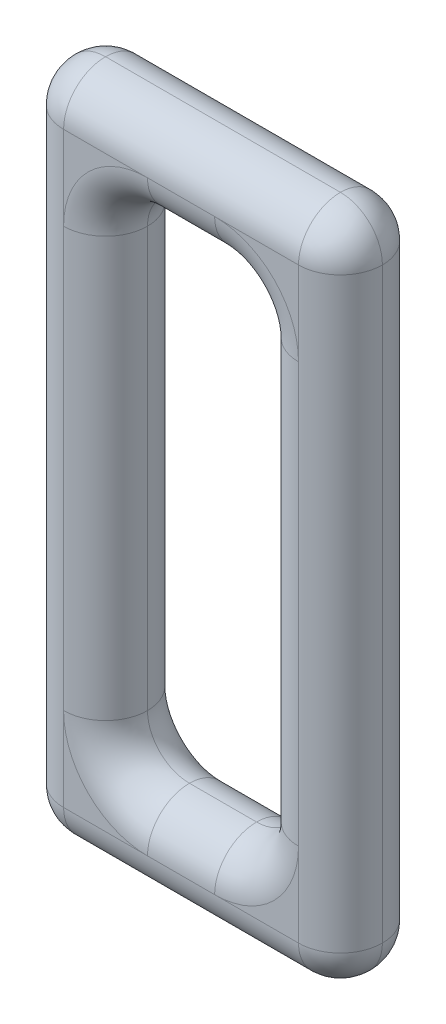
ISO-10303-21;
HEADER;
FILE_DESCRIPTION(('STEP AP214'),'2;1');
FILE_NAME('part.step','',(''),(''),'','','');
FILE_SCHEMA(('AUTOMOTIVE_DESIGN { 1 0 10303 214 1 1 1 1 }'));
ENDSEC;
DATA;
#1=APPLICATION_CONTEXT('core data for automotive mechanical design processes');
#2=APPLICATION_PROTOCOL_DEFINITION('international standard','automotive_design',2000,#1);
#3=PRODUCT_CONTEXT('',#1,'mechanical');
#4=PRODUCT('Part','Part','',(#3));
#5=PRODUCT_RELATED_PRODUCT_CATEGORY('part','',(#4));
#6=PRODUCT_DEFINITION_FORMATION('','',#4);
#7=PRODUCT_DEFINITION_CONTEXT('part definition',#1,'design');
#8=PRODUCT_DEFINITION('design','',#6,#7);
#9=PRODUCT_DEFINITION_SHAPE('','',#8);
#10=(LENGTH_UNIT() NAMED_UNIT(*) SI_UNIT(.MILLI.,.METRE.));
#11=(NAMED_UNIT(*) PLANE_ANGLE_UNIT() SI_UNIT($,.RADIAN.));
#12=(NAMED_UNIT(*) SI_UNIT($,.STERADIAN.) SOLID_ANGLE_UNIT());
#13=UNCERTAINTY_MEASURE_WITH_UNIT(LENGTH_MEASURE(1.E-05),#10,'distance_accuracy_value','');
#14=(GEOMETRIC_REPRESENTATION_CONTEXT(3) GLOBAL_UNCERTAINTY_ASSIGNED_CONTEXT((#13)) GLOBAL_UNIT_ASSIGNED_CONTEXT((#10,
#11,#12)) REPRESENTATION_CONTEXT('',''));
#15=CARTESIAN_POINT('',(0.,0.,0.));
#16=DIRECTION('',(0.,0.,1.));
#17=DIRECTION('',(1.,0.,0.));
#18=AXIS2_PLACEMENT_3D('',#15,#16,#17);
#19=CARTESIAN_POINT('',(0.,0.,25.));
#20=DIRECTION('',(0.,0.,1.));
#21=DIRECTION('',(1.,0.,0.));
#22=AXIS2_PLACEMENT_3D('',#19,#20,#21);
#23=PLANE('',#22);
#24=CARTESIAN_POINT('',(20.,-300.,25.));
#25=DIRECTION('',(0.,0.,1.));
#26=DIRECTION('',(1.,0.,0.));
#27=AXIS2_PLACEMENT_3D('',#24,#25,#26);
#28=CIRCLE('',#27,50.);
#29=CARTESIAN_POINT('',(20.,-350.,25.));
#30=VERTEX_POINT('',#29);
#31=CARTESIAN_POINT('',(70.,-300.,25.));
#32=VERTEX_POINT('',#31);
#33=EDGE_CURVE('E11',#30,#32,#28,.T.);
#34=ORIENTED_EDGE('',*,*,#33,.F.);
#35=DIRECTION('',(1.,0.,0.));
#36=VECTOR('',#35,1.);
#37=CARTESIAN_POINT('',(94.9999999999999,-350.,25.));
#38=LINE('',#37,#36);
#39=CARTESIAN_POINT('',(69.9999999999999,-350.,25.));
#40=VERTEX_POINT('',#39);
#41=EDGE_CURVE('E50',#30,#40,#38,.T.);
#42=ORIENTED_EDGE('',*,*,#41,.T.);
#43=DIRECTION('',(0.,1.,0.));
#44=VECTOR('',#43,1.);
#45=CARTESIAN_POINT('',(70.,25.,25.));
#46=LINE('',#45,#44);
#47=EDGE_CURVE('E194',#40,#32,#46,.T.);
#48=ORIENTED_EDGE('',*,*,#47,.T.);
#49=EDGE_LOOP('',(#34,#42,#48));
#50=FACE_BOUND('',#49,.T.);
#51=ADVANCED_FACE('F39',(#50),#23,.T.);
#52=DIRECTION('',(0.,-1.,0.));
#53=VECTOR('',#52,1.);
#54=CARTESIAN_POINT('',(-69.9999999999999,-375.,25.));
#55=LINE('',#54,#53);
#56=CARTESIAN_POINT('',(-70.,-300.,25.));
#57=VERTEX_POINT('',#56);
#58=CARTESIAN_POINT('',(-69.9999999999999,-350.,25.));
#59=VERTEX_POINT('',#58);
#60=EDGE_CURVE('E340',#57,#59,#55,.T.);
#61=ORIENTED_EDGE('',*,*,#60,.T.);
#62=DIRECTION('',(1.,0.,0.));
#63=VECTOR('',#62,1.);
#64=CARTESIAN_POINT('',(94.9999999999999,-350.,25.));
#65=LINE('',#64,#63);
#66=CARTESIAN_POINT('',(-20.,-350.,25.));
#67=VERTEX_POINT('',#66);
#68=EDGE_CURVE('E209',#59,#67,#65,.T.);
#69=ORIENTED_EDGE('',*,*,#68,.T.);
#70=CARTESIAN_POINT('',(-20.,-300.,25.));
#71=DIRECTION('',(0.,0.,1.));
#72=DIRECTION('',(1.,0.,0.));
#73=AXIS2_PLACEMENT_3D('',#70,#71,#72);
#74=CIRCLE('',#73,50.);
#75=EDGE_CURVE('E343',#57,#67,#74,.T.);
#76=ORIENTED_EDGE('',*,*,#75,.F.);
#77=EDGE_LOOP('',(#61,#69,#76));
#78=FACE_BOUND('',#77,.T.);
#79=ADVANCED_FACE('F566',(#78),#23,.T.);
#80=CARTESIAN_POINT('',(-20.,-50.,25.));
#81=DIRECTION('',(0.,0.,1.));
#82=DIRECTION('',(1.,0.,0.));
#83=AXIS2_PLACEMENT_3D('',#80,#81,#82);
#84=CIRCLE('',#83,50.);
#85=CARTESIAN_POINT('',(-20.,0.,25.));
#86=VERTEX_POINT('',#85);
#87=CARTESIAN_POINT('',(-70.,-50.,25.));
#88=VERTEX_POINT('',#87);
#89=EDGE_CURVE('E325',#86,#88,#84,.T.);
#90=ORIENTED_EDGE('',*,*,#89,.F.);
#91=DIRECTION('',(-1.,0.,0.));
#92=VECTOR('',#91,1.);
#93=CARTESIAN_POINT('',(-95.,0.,25.));
#94=LINE('',#93,#92);
#95=CARTESIAN_POINT('',(-70.,0.,25.));
#96=VERTEX_POINT('',#95);
#97=EDGE_CURVE('E319',#86,#96,#94,.T.);
#98=ORIENTED_EDGE('',*,*,#97,.T.);
#99=DIRECTION('',(0.,-1.,0.));
#100=VECTOR('',#99,1.);
#101=CARTESIAN_POINT('',(-69.9999999999999,-375.,25.));
#102=LINE('',#101,#100);
#103=EDGE_CURVE('E322',#96,#88,#102,.T.);
#104=ORIENTED_EDGE('',*,*,#103,.T.);
#105=EDGE_LOOP('',(#90,#98,#104));
#106=FACE_BOUND('',#105,.T.);
#107=ADVANCED_FACE('F572',(#106),#23,.T.);
#108=CARTESIAN_POINT('',(0.,0.,-25.));
#109=DIRECTION('',(0.,0.,1.));
#110=DIRECTION('',(1.,0.,0.));
#111=AXIS2_PLACEMENT_3D('',#108,#109,#110);
#112=PLANE('',#111);
#113=CARTESIAN_POINT('',(20.,-300.,-25.));
#114=DIRECTION('',(0.,0.,1.));
#115=DIRECTION('',(1.,0.,0.));
#116=AXIS2_PLACEMENT_3D('',#113,#114,#115);
#117=CIRCLE('',#116,50.);
#118=CARTESIAN_POINT('',(70.,-300.,-25.));
#119=VERTEX_POINT('',#118);
#120=CARTESIAN_POINT('',(20.,-350.,-25.));
#121=VERTEX_POINT('',#120);
#122=EDGE_CURVE('E315',#119,#121,#117,.F.);
#123=ORIENTED_EDGE('',*,*,#122,.F.);
#124=DIRECTION('',(0.,1.,0.));
#125=VECTOR('',#124,1.);
#126=CARTESIAN_POINT('',(70.,0.,-25.));
#127=LINE('',#126,#125);
#128=CARTESIAN_POINT('',(69.9999999999999,-350.,-25.));
#129=VERTEX_POINT('',#128);
#130=EDGE_CURVE('E312',#119,#129,#127,.F.);
#131=ORIENTED_EDGE('',*,*,#130,.T.);
#132=DIRECTION('',(1.,0.,0.));
#133=VECTOR('',#132,1.);
#134=CARTESIAN_POINT('',(0.,-350.,-25.));
#135=LINE('',#134,#133);
#136=EDGE_CURVE('E309',#129,#121,#135,.F.);
#137=ORIENTED_EDGE('',*,*,#136,.T.);
#138=EDGE_LOOP('',(#123,#131,#137));
#139=FACE_BOUND('',#138,.T.);
#140=ADVANCED_FACE('F583',(#139),#112,.F.);
#141=CARTESIAN_POINT('',(-20.,-300.,-25.));
#142=DIRECTION('',(0.,0.,1.));
#143=DIRECTION('',(1.,0.,0.));
#144=AXIS2_PLACEMENT_3D('',#141,#142,#143);
#145=CIRCLE('',#144,50.);
#146=CARTESIAN_POINT('',(-20.,-350.,-25.));
#147=VERTEX_POINT('',#146);
#148=CARTESIAN_POINT('',(-70.,-300.,-25.));
#149=VERTEX_POINT('',#148);
#150=EDGE_CURVE('E305',#147,#149,#145,.F.);
#151=ORIENTED_EDGE('',*,*,#150,.F.);
#152=DIRECTION('',(1.,0.,0.));
#153=VECTOR('',#152,1.);
#154=CARTESIAN_POINT('',(0.,-350.,-25.));
#155=LINE('',#154,#153);
#156=CARTESIAN_POINT('',(-69.9999999999999,-350.,-25.));
#157=VERTEX_POINT('',#156);
#158=EDGE_CURVE('E302',#147,#157,#155,.F.);
#159=ORIENTED_EDGE('',*,*,#158,.T.);
#160=DIRECTION('',(0.,-1.,0.));
#161=VECTOR('',#160,1.);
#162=CARTESIAN_POINT('',(-70.,0.,-25.));
#163=LINE('',#162,#161);
#164=EDGE_CURVE('E299',#157,#149,#163,.F.);
#165=ORIENTED_EDGE('',*,*,#164,.T.);
#166=EDGE_LOOP('',(#151,#159,#165));
#167=FACE_BOUND('',#166,.T.);
#168=ADVANCED_FACE('F589',(#167),#112,.F.);
#169=CARTESIAN_POINT('',(-20.,-50.,-25.));
#170=DIRECTION('',(0.,0.,1.));
#171=DIRECTION('',(1.,0.,0.));
#172=AXIS2_PLACEMENT_3D('',#169,#170,#171);
#173=CIRCLE('',#172,50.);
#174=CARTESIAN_POINT('',(-70.,-50.,-25.));
#175=VERTEX_POINT('',#174);
#176=CARTESIAN_POINT('',(-20.,0.,-25.));
#177=VERTEX_POINT('',#176);
#178=EDGE_CURVE('E295',#175,#177,#173,.F.);
#179=ORIENTED_EDGE('',*,*,#178,.F.);
#180=DIRECTION('',(0.,-1.,0.));
#181=VECTOR('',#180,1.);
#182=CARTESIAN_POINT('',(-70.,0.,-25.));
#183=LINE('',#182,#181);
#184=CARTESIAN_POINT('',(-70.,0.,-25.));
#185=VERTEX_POINT('',#184);
#186=EDGE_CURVE('E292',#175,#185,#183,.F.);
#187=ORIENTED_EDGE('',*,*,#186,.T.);
#188=DIRECTION('',(-1.,0.,0.));
#189=VECTOR('',#188,1.);
#190=CARTESIAN_POINT('',(0.,0.,-25.));
#191=LINE('',#190,#189);
#192=EDGE_CURVE('E289',#185,#177,#191,.F.);
#193=ORIENTED_EDGE('',*,*,#192,.T.);
#194=EDGE_LOOP('',(#179,#187,#193));
#195=FACE_BOUND('',#194,.T.);
#196=ADVANCED_FACE('F547',(#195),#112,.F.);
#197=CARTESIAN_POINT('',(20.,-50.,-25.));
#198=DIRECTION('',(0.,0.,1.));
#199=DIRECTION('',(1.,0.,0.));
#200=AXIS2_PLACEMENT_3D('',#197,#198,#199);
#201=CIRCLE('',#200,50.);
#202=CARTESIAN_POINT('',(20.,0.,-25.));
#203=VERTEX_POINT('',#202);
#204=CARTESIAN_POINT('',(70.,-50.,-25.));
#205=VERTEX_POINT('',#204);
#206=EDGE_CURVE('E283',#203,#205,#201,.F.);
#207=ORIENTED_EDGE('',*,*,#206,.F.);
#208=DIRECTION('',(-1.,0.,0.));
#209=VECTOR('',#208,1.);
#210=CARTESIAN_POINT('',(0.,0.,-25.));
#211=LINE('',#210,#209);
#212=CARTESIAN_POINT('',(70.,0.,-25.));
#213=VERTEX_POINT('',#212);
#214=EDGE_CURVE('E271',#203,#213,#211,.F.);
#215=ORIENTED_EDGE('',*,*,#214,.T.);
#216=DIRECTION('',(0.,1.,0.));
#217=VECTOR('',#216,1.);
#218=CARTESIAN_POINT('',(70.,0.,-25.));
#219=LINE('',#218,#217);
#220=EDGE_CURVE('E276',#213,#205,#219,.F.);
#221=ORIENTED_EDGE('',*,*,#220,.T.);
#222=EDGE_LOOP('',(#207,#215,#221));
#223=FACE_BOUND('',#222,.T.);
#224=ADVANCED_FACE('F576',(#223),#112,.F.);
#225=CARTESIAN_POINT('',(20.,-50.,25.));
#226=DIRECTION('',(0.,0.,1.));
#227=DIRECTION('',(1.,0.,0.));
#228=AXIS2_PLACEMENT_3D('',#225,#226,#227);
#229=CIRCLE('',#228,50.);
#230=CARTESIAN_POINT('',(70.,-50.,25.));
#231=VERTEX_POINT('',#230);
#232=CARTESIAN_POINT('',(20.,0.,25.));
#233=VERTEX_POINT('',#232);
#234=EDGE_CURVE('E332',#231,#233,#229,.T.);
#235=ORIENTED_EDGE('',*,*,#234,.F.);
#236=DIRECTION('',(0.,1.,0.));
#237=VECTOR('',#236,1.);
#238=CARTESIAN_POINT('',(70.,25.,25.));
#239=LINE('',#238,#237);
#240=CARTESIAN_POINT('',(70.,0.,25.));
#241=VERTEX_POINT('',#240);
#242=EDGE_CURVE('E336',#231,#241,#239,.T.);
#243=ORIENTED_EDGE('',*,*,#242,.T.);
#244=DIRECTION('',(-1.,0.,0.));
#245=VECTOR('',#244,1.);
#246=CARTESIAN_POINT('',(-95.,0.,25.));
#247=LINE('',#246,#245);
#248=EDGE_CURVE('E329',#241,#233,#247,.T.);
#249=ORIENTED_EDGE('',*,*,#248,.T.);
#250=EDGE_LOOP('',(#235,#243,#249));
#251=FACE_BOUND('',#250,.T.);
#252=ADVANCED_FACE('F568',(#251),#23,.T.);
#253=CARTESIAN_POINT('',(70.,0.,0.));
#254=DIRECTION('',(0.,-1.,0.));
#255=DIRECTION('',(1.,0.,0.));
#256=AXIS2_PLACEMENT_3D('',#253,#254,#255);
#257=CYLINDRICAL_SURFACE('',#256,25.);
#258=DIRECTION('',(0.,1.,0.));
#259=VECTOR('',#258,1.);
#260=CARTESIAN_POINT('',(94.9999999999999,-375.,0.));
#261=LINE('',#260,#259);
#262=CARTESIAN_POINT('',(95.,0.,0.));
#263=VERTEX_POINT('',#262);
#264=CARTESIAN_POINT('',(94.9999999999999,-350.,0.));
#265=VERTEX_POINT('',#264);
#266=EDGE_CURVE('E265',#263,#265,#261,.F.);
#267=ORIENTED_EDGE('',*,*,#266,.F.);
#268=CARTESIAN_POINT('',(70.,0.,0.));
#269=DIRECTION('',(0.,1.,0.));
#270=DIRECTION('',(-1.,0.,0.));
#271=AXIS2_PLACEMENT_3D('',#268,#269,#270);
#272=CIRCLE('',#271,25.);
#273=EDGE_CURVE('E43',#241,#263,#272,.T.);
#274=ORIENTED_EDGE('',*,*,#273,.F.);
#275=ORIENTED_EDGE('',*,*,#242,.F.);
#276=DIRECTION('',(0.,1.,0.));
#277=VECTOR('',#276,1.);
#278=CARTESIAN_POINT('',(70.,25.,25.));
#279=LINE('',#278,#277);
#280=EDGE_CURVE('E206',#32,#231,#279,.T.);
#281=ORIENTED_EDGE('',*,*,#280,.F.);
#282=ORIENTED_EDGE('',*,*,#47,.F.);
#283=CARTESIAN_POINT('',(69.9999999999999,-350.,0.));
#284=DIRECTION('',(0.,-1.,0.));
#285=DIRECTION('',(0.,0.,-1.));
#286=AXIS2_PLACEMENT_3D('',#283,#284,#285);
#287=CIRCLE('',#286,25.);
#288=EDGE_CURVE('E202',#265,#40,#287,.T.);
#289=ORIENTED_EDGE('',*,*,#288,.F.);
#290=EDGE_LOOP('',(#267,#274,#275,#281,#282,#289));
#291=FACE_BOUND('',#290,.T.);
#292=ADVANCED_FACE('F41',(#291),#257,.T.);
#293=CARTESIAN_POINT('',(70.,0.,0.));
#294=DIRECTION('',(0.,0.,1.));
#295=DIRECTION('',(1.,0.,0.));
#296=AXIS2_PLACEMENT_3D('',#293,#294,#295);
#297=SPHERICAL_SURFACE('',#296,25.);
#298=ORIENTED_EDGE('',*,*,#273,.T.);
#299=CARTESIAN_POINT('',(70.,0.,0.));
#300=DIRECTION('',(0.,0.,-1.));
#301=DIRECTION('',(-1.,0.,0.));
#302=AXIS2_PLACEMENT_3D('',#299,#300,#301);
#303=CIRCLE('',#302,25.);
#304=CARTESIAN_POINT('',(70.,25.,0.));
#305=VERTEX_POINT('',#304);
#306=EDGE_CURVE('E119',#305,#263,#303,.T.);
#307=ORIENTED_EDGE('',*,*,#306,.F.);
#308=CARTESIAN_POINT('',(70.,0.,0.));
#309=DIRECTION('',(1.,0.,0.));
#310=DIRECTION('',(0.,0.,-1.));
#311=AXIS2_PLACEMENT_3D('',#308,#309,#310);
#312=CIRCLE('',#311,25.);
#313=EDGE_CURVE('E245',#241,#305,#312,.F.);
#314=ORIENTED_EDGE('',*,*,#313,.F.);
#315=EDGE_LOOP('',(#298,#307,#314));
#316=FACE_BOUND('',#315,.T.);
#317=ADVANCED_FACE('F582',(#316),#297,.T.);
#318=CARTESIAN_POINT('',(70.,25.,0.));
#319=DIRECTION('',(0.,1.,0.));
#320=DIRECTION('',(-1.,0.,0.));
#321=AXIS2_PLACEMENT_3D('',#318,#319,#320);
#322=CYLINDRICAL_SURFACE('',#321,25.);
#323=CARTESIAN_POINT('',(70.,0.,0.));
#324=DIRECTION('',(0.,1.,0.));
#325=DIRECTION('',(-1.,0.,0.));
#326=AXIS2_PLACEMENT_3D('',#323,#324,#325);
#327=CIRCLE('',#326,25.);
#328=EDGE_CURVE('E251',#263,#213,#327,.T.);
#329=ORIENTED_EDGE('',*,*,#328,.F.);
#330=ORIENTED_EDGE('',*,*,#266,.T.);
#331=CARTESIAN_POINT('',(69.9999999999999,-350.,0.));
#332=DIRECTION('',(0.,-1.,0.));
#333=DIRECTION('',(0.,0.,-1.));
#334=AXIS2_PLACEMENT_3D('',#331,#332,#333);
#335=CIRCLE('',#334,25.);
#336=EDGE_CURVE('E241',#129,#265,#335,.T.);
#337=ORIENTED_EDGE('',*,*,#336,.F.);
#338=ORIENTED_EDGE('',*,*,#130,.F.);
#339=DIRECTION('',(0.,1.,0.));
#340=VECTOR('',#339,1.);
#341=CARTESIAN_POINT('',(70.,0.,-25.));
#342=LINE('',#341,#340);
#343=EDGE_CURVE('E237',#205,#119,#342,.F.);
#344=ORIENTED_EDGE('',*,*,#343,.F.);
#345=ORIENTED_EDGE('',*,*,#220,.F.);
#346=EDGE_LOOP('',(#329,#330,#337,#338,#344,#345));
#347=FACE_BOUND('',#346,.T.);
#348=ADVANCED_FACE('F613',(#347),#322,.T.);
#349=CARTESIAN_POINT('',(70.,-25.,0.));
#350=DIRECTION('',(0.,1.,0.));
#351=DIRECTION('',(-1.,0.,0.));
#352=AXIS2_PLACEMENT_3D('',#349,#350,#351);
#353=CYLINDRICAL_SURFACE('',#352,25.);
#354=CARTESIAN_POINT('',(70.,-300.,0.));
#355=DIRECTION('',(0.,-1.,0.));
#356=DIRECTION('',(0.,0.,-1.));
#357=AXIS2_PLACEMENT_3D('',#354,#355,#356);
#358=CIRCLE('',#357,25.);
#359=CARTESIAN_POINT('',(45.,-300.,0.));
#360=VERTEX_POINT('',#359);
#361=EDGE_CURVE('E221',#32,#360,#358,.T.);
#362=ORIENTED_EDGE('',*,*,#361,.F.);
#363=ORIENTED_EDGE('',*,*,#280,.T.);
#364=CARTESIAN_POINT('',(70.,-50.,0.));
#365=DIRECTION('',(0.,1.,0.));
#366=DIRECTION('',(0.,0.,1.));
#367=AXIS2_PLACEMENT_3D('',#364,#365,#366);
#368=CIRCLE('',#367,25.);
#369=CARTESIAN_POINT('',(45.,-50.,0.));
#370=VERTEX_POINT('',#369);
#371=EDGE_CURVE('E258',#370,#231,#368,.T.);
#372=ORIENTED_EDGE('',*,*,#371,.F.);
#373=DIRECTION('',(0.,1.,0.));
#374=VECTOR('',#373,1.);
#375=CARTESIAN_POINT('',(45.,-25.,0.));
#376=LINE('',#375,#374);
#377=EDGE_CURVE('E227',#360,#370,#376,.T.);
#378=ORIENTED_EDGE('',*,*,#377,.F.);
#379=EDGE_LOOP('',(#362,#363,#372,#378));
#380=FACE_BOUND('',#379,.T.);
#381=ADVANCED_FACE('F509',(#380),#353,.T.);
#382=CARTESIAN_POINT('',(69.9999999999999,-350.,0.));
#383=DIRECTION('',(0.,0.,1.));
#384=DIRECTION('',(1.,0.,0.));
#385=AXIS2_PLACEMENT_3D('',#382,#383,#384);
#386=SPHERICAL_SURFACE('',#385,25.);
#387=CARTESIAN_POINT('',(69.9999999999999,-350.,0.));
#388=DIRECTION('',(0.,0.,1.));
#389=DIRECTION('',(1.,0.,0.));
#390=AXIS2_PLACEMENT_3D('',#387,#388,#389);
#391=CIRCLE('',#390,25.);
#392=CARTESIAN_POINT('',(69.9999999999999,-375.,0.));
#393=VERTEX_POINT('',#392);
#394=EDGE_CURVE('E112',#393,#265,#391,.T.);
#395=ORIENTED_EDGE('',*,*,#394,.T.);
#396=ORIENTED_EDGE('',*,*,#288,.T.);
#397=CARTESIAN_POINT('',(69.9999999999999,-350.,0.));
#398=DIRECTION('',(1.,0.,0.));
#399=DIRECTION('',(0.,0.,-1.));
#400=AXIS2_PLACEMENT_3D('',#397,#398,#399);
#401=CIRCLE('',#400,25.);
#402=EDGE_CURVE('E212',#393,#40,#401,.F.);
#403=ORIENTED_EDGE('',*,*,#402,.F.);
#404=EDGE_LOOP('',(#395,#396,#403));
#405=FACE_BOUND('',#404,.T.);
#406=ADVANCED_FACE('F211',(#405),#386,.T.);
#407=CARTESIAN_POINT('',(20.,-50.,0.));
#408=DIRECTION('',(0.,0.,1.));
#409=DIRECTION('',(1.,0.,0.));
#410=AXIS2_PLACEMENT_3D('',#407,#408,#409);
#411=TOROIDAL_SURFACE('',#410,50.,25.);
#412=CARTESIAN_POINT('',(20.,-50.,0.));
#413=DIRECTION('',(0.,0.,1.));
#414=DIRECTION('',(1.,0.,0.));
#415=AXIS2_PLACEMENT_3D('',#412,#413,#414);
#416=CIRCLE('',#415,25.);
#417=CARTESIAN_POINT('',(20.,-25.,0.));
#418=VERTEX_POINT('',#417);
#419=EDGE_CURVE('E254',#370,#418,#416,.T.);
#420=ORIENTED_EDGE('',*,*,#419,.F.);
#421=ORIENTED_EDGE('',*,*,#371,.T.);
#422=ORIENTED_EDGE('',*,*,#234,.T.);
#423=CARTESIAN_POINT('',(20.,0.,0.));
#424=DIRECTION('',(1.,0.,0.));
#425=DIRECTION('',(0.,0.,-1.));
#426=AXIS2_PLACEMENT_3D('',#423,#424,#425);
#427=CIRCLE('',#426,25.);
#428=EDGE_CURVE('E230',#418,#233,#427,.F.);
#429=ORIENTED_EDGE('',*,*,#428,.F.);
#430=EDGE_LOOP('',(#420,#421,#422,#429));
#431=FACE_BOUND('',#430,.T.);
#432=ADVANCED_FACE('F499',(#431),#411,.T.);
#433=CARTESIAN_POINT('',(70.,0.,0.));
#434=DIRECTION('',(0.,0.,1.));
#435=DIRECTION('',(1.,0.,0.));
#436=AXIS2_PLACEMENT_3D('',#433,#434,#435);
#437=SPHERICAL_SURFACE('',#436,25.);
#438=ORIENTED_EDGE('',*,*,#306,.T.);
#439=ORIENTED_EDGE('',*,*,#328,.T.);
#440=CARTESIAN_POINT('',(70.,0.,0.));
#441=DIRECTION('',(1.,0.,0.));
#442=DIRECTION('',(0.,0.,-1.));
#443=AXIS2_PLACEMENT_3D('',#440,#441,#442);
#444=CIRCLE('',#443,25.);
#445=EDGE_CURVE('E483',#305,#213,#444,.F.);
#446=ORIENTED_EDGE('',*,*,#445,.F.);
#447=EDGE_LOOP('',(#438,#439,#446));
#448=FACE_BOUND('',#447,.T.);
#449=ADVANCED_FACE('F624',(#448),#437,.T.);
#450=CARTESIAN_POINT('',(0.,0.,0.));
#451=DIRECTION('',(1.,0.,0.));
#452=DIRECTION('',(0.,0.,-1.));
#453=AXIS2_PLACEMENT_3D('',#450,#451,#452);
#454=CYLINDRICAL_SURFACE('',#453,25.);
#455=ORIENTED_EDGE('',*,*,#248,.F.);
#456=ORIENTED_EDGE('',*,*,#313,.T.);
#457=DIRECTION('',(-1.,0.,0.));
#458=VECTOR('',#457,1.);
#459=CARTESIAN_POINT('',(95.,25.,0.));
#460=LINE('',#459,#458);
#461=CARTESIAN_POINT('',(-70.,25.,0.));
#462=VERTEX_POINT('',#461);
#463=EDGE_CURVE('E479',#462,#305,#460,.F.);
#464=ORIENTED_EDGE('',*,*,#463,.F.);
#465=CARTESIAN_POINT('',(-70.,0.,0.));
#466=DIRECTION('',(-1.,0.,0.));
#467=DIRECTION('',(0.,0.,1.));
#468=AXIS2_PLACEMENT_3D('',#465,#466,#467);
#469=CIRCLE('',#468,25.);
#470=EDGE_CURVE('E475',#96,#462,#469,.T.);
#471=ORIENTED_EDGE('',*,*,#470,.F.);
#472=ORIENTED_EDGE('',*,*,#97,.F.);
#473=DIRECTION('',(-1.,0.,0.));
#474=VECTOR('',#473,1.);
#475=CARTESIAN_POINT('',(-95.,0.,25.));
#476=LINE('',#475,#474);
#477=EDGE_CURVE('E222',#233,#86,#476,.T.);
#478=ORIENTED_EDGE('',*,*,#477,.F.);
#479=EDGE_LOOP('',(#455,#456,#464,#471,#472,#478));
#480=FACE_BOUND('',#479,.T.);
#481=ADVANCED_FACE('F617',(#480),#454,.T.);
#482=CARTESIAN_POINT('',(69.9999999999999,-350.,0.));
#483=DIRECTION('',(0.,0.,1.));
#484=DIRECTION('',(1.,0.,0.));
#485=AXIS2_PLACEMENT_3D('',#482,#483,#484);
#486=SPHERICAL_SURFACE('',#485,25.);
#487=ORIENTED_EDGE('',*,*,#336,.T.);
#488=ORIENTED_EDGE('',*,*,#394,.F.);
#489=CARTESIAN_POINT('',(69.9999999999999,-350.,0.));
#490=DIRECTION('',(1.,0.,0.));
#491=DIRECTION('',(0.,0.,-1.));
#492=AXIS2_PLACEMENT_3D('',#489,#490,#491);
#493=CIRCLE('',#492,25.);
#494=EDGE_CURVE('E462',#129,#393,#493,.F.);
#495=ORIENTED_EDGE('',*,*,#494,.F.);
#496=EDGE_LOOP('',(#487,#488,#495));
#497=FACE_BOUND('',#496,.T.);
#498=ADVANCED_FACE('F615',(#497),#486,.T.);
#499=CARTESIAN_POINT('',(70.,0.,0.));
#500=DIRECTION('',(0.,-1.,0.));
#501=DIRECTION('',(1.,0.,0.));
#502=AXIS2_PLACEMENT_3D('',#499,#500,#501);
#503=CYLINDRICAL_SURFACE('',#502,25.);
#504=CARTESIAN_POINT('',(70.,-300.,0.));
#505=DIRECTION('',(0.,-1.,0.));
#506=DIRECTION('',(0.,0.,-1.));
#507=AXIS2_PLACEMENT_3D('',#504,#505,#506);
#508=CIRCLE('',#507,25.);
#509=EDGE_CURVE('E459',#360,#119,#508,.T.);
#510=ORIENTED_EDGE('',*,*,#509,.F.);
#511=ORIENTED_EDGE('',*,*,#377,.T.);
#512=CARTESIAN_POINT('',(70.,-50.,0.));
#513=DIRECTION('',(0.,1.,0.));
#514=DIRECTION('',(0.,0.,1.));
#515=AXIS2_PLACEMENT_3D('',#512,#513,#514);
#516=CIRCLE('',#515,25.);
#517=EDGE_CURVE('E487',#205,#370,#516,.T.);
#518=ORIENTED_EDGE('',*,*,#517,.F.);
#519=ORIENTED_EDGE('',*,*,#343,.T.);
#520=EDGE_LOOP('',(#510,#511,#518,#519));
#521=FACE_BOUND('',#520,.T.);
#522=ADVANCED_FACE('F505',(#521),#503,.T.);
#523=CARTESIAN_POINT('',(20.,-300.,0.));
#524=DIRECTION('',(0.,0.,1.));
#525=DIRECTION('',(1.,0.,0.));
#526=AXIS2_PLACEMENT_3D('',#523,#524,#525);
#527=TOROIDAL_SURFACE('',#526,50.,25.);
#528=ORIENTED_EDGE('',*,*,#361,.T.);
#529=CARTESIAN_POINT('',(20.,-300.,0.));
#530=DIRECTION('',(0.,0.,1.));
#531=DIRECTION('',(1.,0.,0.));
#532=AXIS2_PLACEMENT_3D('',#529,#530,#531);
#533=CIRCLE('',#532,25.);
#534=CARTESIAN_POINT('',(20.,-325.,0.));
#535=VERTEX_POINT('',#534);
#536=EDGE_CURVE('E455',#535,#360,#533,.T.);
#537=ORIENTED_EDGE('',*,*,#536,.F.);
#538=CARTESIAN_POINT('',(20.,-350.,0.));
#539=DIRECTION('',(1.,0.,0.));
#540=DIRECTION('',(0.,0.,-1.));
#541=AXIS2_PLACEMENT_3D('',#538,#539,#540);
#542=CIRCLE('',#541,25.);
#543=EDGE_CURVE('E452',#30,#535,#542,.F.);
#544=ORIENTED_EDGE('',*,*,#543,.F.);
#545=ORIENTED_EDGE('',*,*,#33,.T.);
#546=EDGE_LOOP('',(#528,#537,#544,#545));
#547=FACE_BOUND('',#546,.T.);
#548=ADVANCED_FACE('F514',(#547),#527,.T.);
#549=CARTESIAN_POINT('',(-45.,0.,0.));
#550=DIRECTION('',(-1.,0.,0.));
#551=DIRECTION('',(0.,0.,1.));
#552=AXIS2_PLACEMENT_3D('',#549,#550,#551);
#553=CYLINDRICAL_SURFACE('',#552,25.);
#554=ORIENTED_EDGE('',*,*,#428,.T.);
#555=ORIENTED_EDGE('',*,*,#477,.T.);
#556=CARTESIAN_POINT('',(-20.,0.,0.));
#557=DIRECTION('',(-1.,0.,0.));
#558=DIRECTION('',(0.,0.,1.));
#559=AXIS2_PLACEMENT_3D('',#556,#557,#558);
#560=CIRCLE('',#559,25.);
#561=CARTESIAN_POINT('',(-20.,-25.,0.));
#562=VERTEX_POINT('',#561);
#563=EDGE_CURVE('E444',#562,#86,#560,.T.);
#564=ORIENTED_EDGE('',*,*,#563,.F.);
#565=DIRECTION('',(-1.,0.,0.));
#566=VECTOR('',#565,1.);
#567=CARTESIAN_POINT('',(-45.,-25.,0.));
#568=LINE('',#567,#566);
#569=EDGE_CURVE('E436',#418,#562,#568,.T.);
#570=ORIENTED_EDGE('',*,*,#569,.F.);
#571=EDGE_LOOP('',(#554,#555,#564,#570));
#572=FACE_BOUND('',#571,.T.);
#573=ADVANCED_FACE('F494',(#572),#553,.T.);
#574=CARTESIAN_POINT('',(20.,-50.,0.));
#575=DIRECTION('',(0.,0.,1.));
#576=DIRECTION('',(1.,0.,0.));
#577=AXIS2_PLACEMENT_3D('',#574,#575,#576);
#578=TOROIDAL_SURFACE('',#577,50.,25.);
#579=ORIENTED_EDGE('',*,*,#517,.T.);
#580=ORIENTED_EDGE('',*,*,#419,.T.);
#581=CARTESIAN_POINT('',(20.,0.,0.));
#582=DIRECTION('',(1.,0.,0.));
#583=DIRECTION('',(0.,0.,-1.));
#584=AXIS2_PLACEMENT_3D('',#581,#582,#583);
#585=CIRCLE('',#584,25.);
#586=EDGE_CURVE('E433',#203,#418,#585,.F.);
#587=ORIENTED_EDGE('',*,*,#586,.F.);
#588=ORIENTED_EDGE('',*,*,#206,.T.);
#589=EDGE_LOOP('',(#579,#580,#587,#588));
#590=FACE_BOUND('',#589,.T.);
#591=ADVANCED_FACE('F501',(#590),#578,.T.);
#592=CARTESIAN_POINT('',(-95.,0.,0.));
#593=DIRECTION('',(-1.,0.,0.));
#594=DIRECTION('',(0.,0.,1.));
#595=AXIS2_PLACEMENT_3D('',#592,#593,#594);
#596=CYLINDRICAL_SURFACE('',#595,25.);
#597=CARTESIAN_POINT('',(-70.,0.,0.));
#598=DIRECTION('',(-1.,0.,0.));
#599=DIRECTION('',(0.,0.,1.));
#600=AXIS2_PLACEMENT_3D('',#597,#598,#599);
#601=CIRCLE('',#600,25.);
#602=EDGE_CURVE('E427',#462,#185,#601,.T.);
#603=ORIENTED_EDGE('',*,*,#602,.F.);
#604=ORIENTED_EDGE('',*,*,#463,.T.);
#605=ORIENTED_EDGE('',*,*,#445,.T.);
#606=ORIENTED_EDGE('',*,*,#214,.F.);
#607=DIRECTION('',(-1.,0.,0.));
#608=VECTOR('',#607,1.);
#609=CARTESIAN_POINT('',(0.,0.,-25.));
#610=LINE('',#609,#608);
#611=EDGE_CURVE('E128',#177,#203,#610,.F.);
#612=ORIENTED_EDGE('',*,*,#611,.F.);
#613=ORIENTED_EDGE('',*,*,#192,.F.);
#614=EDGE_LOOP('',(#603,#604,#605,#606,#612,#613));
#615=FACE_BOUND('',#614,.T.);
#616=ADVANCED_FACE('F550',(#615),#596,.T.);
#617=CARTESIAN_POINT('',(0.,-350.,0.));
#618=DIRECTION('',(-1.,0.,0.));
#619=DIRECTION('',(0.,0.,1.));
#620=AXIS2_PLACEMENT_3D('',#617,#618,#619);
#621=CYLINDRICAL_SURFACE('',#620,25.);
#622=CARTESIAN_POINT('',(-69.9999999999999,-350.,0.));
#623=DIRECTION('',(-1.,0.,0.));
#624=DIRECTION('',(0.,0.,1.));
#625=AXIS2_PLACEMENT_3D('',#622,#623,#624);
#626=CIRCLE('',#625,25.);
#627=CARTESIAN_POINT('',(-69.9999999999999,-375.,0.));
#628=VERTEX_POINT('',#627);
#629=EDGE_CURVE('E471',#628,#59,#626,.T.);
#630=ORIENTED_EDGE('',*,*,#629,.F.);
#631=DIRECTION('',(1.,0.,0.));
#632=VECTOR('',#631,1.);
#633=CARTESIAN_POINT('',(-94.9999999999999,-375.,0.));
#634=LINE('',#633,#632);
#635=EDGE_CURVE('E218',#393,#628,#634,.F.);
#636=ORIENTED_EDGE('',*,*,#635,.F.);
#637=ORIENTED_EDGE('',*,*,#402,.T.);
#638=ORIENTED_EDGE('',*,*,#41,.F.);
#639=DIRECTION('',(1.,0.,0.));
#640=VECTOR('',#639,1.);
#641=CARTESIAN_POINT('',(94.9999999999999,-350.,25.));
#642=LINE('',#641,#640);
#643=EDGE_CURVE('E59',#67,#30,#642,.T.);
#644=ORIENTED_EDGE('',*,*,#643,.F.);
#645=ORIENTED_EDGE('',*,*,#68,.F.);
#646=EDGE_LOOP('',(#630,#636,#637,#638,#644,#645));
#647=FACE_BOUND('',#646,.T.);
#648=ADVANCED_FACE('F216',(#647),#621,.T.);
#649=CARTESIAN_POINT('',(-69.9999999999999,-350.,0.));
#650=DIRECTION('',(0.,0.,1.));
#651=DIRECTION('',(1.,0.,0.));
#652=AXIS2_PLACEMENT_3D('',#649,#650,#651);
#653=SPHERICAL_SURFACE('',#652,25.);
#654=CARTESIAN_POINT('',(-69.9999999999999,-350.,0.));
#655=DIRECTION('',(0.,0.,1.));
#656=DIRECTION('',(1.,0.,0.));
#657=AXIS2_PLACEMENT_3D('',#654,#655,#656);
#658=CIRCLE('',#657,25.);
#659=CARTESIAN_POINT('',(-94.9999999999999,-350.,0.));
#660=VERTEX_POINT('',#659);
#661=EDGE_CURVE('E467',#628,#660,#658,.F.);
#662=ORIENTED_EDGE('',*,*,#661,.F.);
#663=ORIENTED_EDGE('',*,*,#629,.T.);
#664=CARTESIAN_POINT('',(-69.9999999999999,-350.,0.));
#665=DIRECTION('',(0.,-1.,0.));
#666=DIRECTION('',(0.,0.,-1.));
#667=AXIS2_PLACEMENT_3D('',#664,#665,#666);
#668=CIRCLE('',#667,25.);
#669=EDGE_CURVE('E415',#660,#59,#668,.F.);
#670=ORIENTED_EDGE('',*,*,#669,.F.);
#671=EDGE_LOOP('',(#662,#663,#670));
#672=FACE_BOUND('',#671,.T.);
#673=ADVANCED_FACE('F601',(#672),#653,.T.);
#674=CARTESIAN_POINT('',(-94.9999999999999,-350.,0.));
#675=DIRECTION('',(1.,0.,0.));
#676=DIRECTION('',(0.,0.,-1.));
#677=AXIS2_PLACEMENT_3D('',#674,#675,#676);
#678=CYLINDRICAL_SURFACE('',#677,25.);
#679=ORIENTED_EDGE('',*,*,#494,.T.);
#680=ORIENTED_EDGE('',*,*,#635,.T.);
#681=CARTESIAN_POINT('',(-69.9999999999999,-350.,0.));
#682=DIRECTION('',(-1.,0.,0.));
#683=DIRECTION('',(0.,0.,1.));
#684=AXIS2_PLACEMENT_3D('',#681,#682,#683);
#685=CIRCLE('',#684,25.);
#686=EDGE_CURVE('E411',#157,#628,#685,.T.);
#687=ORIENTED_EDGE('',*,*,#686,.F.);
#688=ORIENTED_EDGE('',*,*,#158,.F.);
#689=DIRECTION('',(1.,0.,0.));
#690=VECTOR('',#689,1.);
#691=CARTESIAN_POINT('',(0.,-350.,-25.));
#692=LINE('',#691,#690);
#693=EDGE_CURVE('E407',#121,#147,#692,.F.);
#694=ORIENTED_EDGE('',*,*,#693,.F.);
#695=ORIENTED_EDGE('',*,*,#136,.F.);
#696=EDGE_LOOP('',(#679,#680,#687,#688,#694,#695));
#697=FACE_BOUND('',#696,.T.);
#698=ADVANCED_FACE('F606',(#697),#678,.T.);
#699=CARTESIAN_POINT('',(20.,-300.,0.));
#700=DIRECTION('',(0.,0.,1.));
#701=DIRECTION('',(1.,0.,0.));
#702=AXIS2_PLACEMENT_3D('',#699,#700,#701);
#703=TOROIDAL_SURFACE('',#702,50.,25.);
#704=ORIENTED_EDGE('',*,*,#509,.T.);
#705=ORIENTED_EDGE('',*,*,#122,.T.);
#706=CARTESIAN_POINT('',(20.,-350.,0.));
#707=DIRECTION('',(1.,0.,0.));
#708=DIRECTION('',(0.,0.,-1.));
#709=AXIS2_PLACEMENT_3D('',#706,#707,#708);
#710=CIRCLE('',#709,25.);
#711=EDGE_CURVE('E403',#535,#121,#710,.F.);
#712=ORIENTED_EDGE('',*,*,#711,.F.);
#713=ORIENTED_EDGE('',*,*,#536,.T.);
#714=EDGE_LOOP('',(#704,#705,#712,#713));
#715=FACE_BOUND('',#714,.T.);
#716=ADVANCED_FACE('F512',(#715),#703,.T.);
#717=CARTESIAN_POINT('',(-45.,-350.,0.));
#718=DIRECTION('',(1.,0.,0.));
#719=DIRECTION('',(0.,0.,-1.));
#720=AXIS2_PLACEMENT_3D('',#717,#718,#719);
#721=CYLINDRICAL_SURFACE('',#720,25.);
#722=CARTESIAN_POINT('',(-20.,-350.,0.));
#723=DIRECTION('',(-1.,0.,0.));
#724=DIRECTION('',(0.,0.,1.));
#725=AXIS2_PLACEMENT_3D('',#722,#723,#724);
#726=CIRCLE('',#725,25.);
#727=CARTESIAN_POINT('',(-20.,-325.,0.));
#728=VERTEX_POINT('',#727);
#729=EDGE_CURVE('E447',#67,#728,#726,.T.);
#730=ORIENTED_EDGE('',*,*,#729,.F.);
#731=ORIENTED_EDGE('',*,*,#643,.T.);
#732=ORIENTED_EDGE('',*,*,#543,.T.);
#733=DIRECTION('',(1.,0.,0.));
#734=VECTOR('',#733,1.);
#735=CARTESIAN_POINT('',(-45.,-325.,0.));
#736=LINE('',#735,#734);
#737=EDGE_CURVE('E399',#728,#535,#736,.T.);
#738=ORIENTED_EDGE('',*,*,#737,.F.);
#739=EDGE_LOOP('',(#730,#731,#732,#738));
#740=FACE_BOUND('',#739,.T.);
#741=ADVANCED_FACE('F516',(#740),#721,.T.);
#742=CARTESIAN_POINT('',(-70.,0.,0.));
#743=DIRECTION('',(0.,0.,1.));
#744=DIRECTION('',(1.,0.,0.));
#745=AXIS2_PLACEMENT_3D('',#742,#743,#744);
#746=SPHERICAL_SURFACE('',#745,25.);
#747=ORIENTED_EDGE('',*,*,#470,.T.);
#748=CARTESIAN_POINT('',(-70.,0.,0.));
#749=DIRECTION('',(0.,0.,-1.));
#750=DIRECTION('',(-1.,0.,0.));
#751=AXIS2_PLACEMENT_3D('',#748,#749,#750);
#752=CIRCLE('',#751,25.);
#753=CARTESIAN_POINT('',(-95.,0.,0.));
#754=VERTEX_POINT('',#753);
#755=EDGE_CURVE('E423',#754,#462,#752,.T.);
#756=ORIENTED_EDGE('',*,*,#755,.F.);
#757=CARTESIAN_POINT('',(-70.,0.,0.));
#758=DIRECTION('',(0.,1.,0.));
#759=DIRECTION('',(-1.,0.,0.));
#760=AXIS2_PLACEMENT_3D('',#757,#758,#759);
#761=CIRCLE('',#760,25.);
#762=EDGE_CURVE('E419',#96,#754,#761,.F.);
#763=ORIENTED_EDGE('',*,*,#762,.F.);
#764=EDGE_LOOP('',(#747,#756,#763));
#765=FACE_BOUND('',#764,.T.);
#766=ADVANCED_FACE('F562',(#765),#746,.T.);
#767=CARTESIAN_POINT('',(-20.,-50.,0.));
#768=DIRECTION('',(0.,0.,1.));
#769=DIRECTION('',(1.,0.,0.));
#770=AXIS2_PLACEMENT_3D('',#767,#768,#769);
#771=TOROIDAL_SURFACE('',#770,50.,25.);
#772=CARTESIAN_POINT('',(-20.,-50.,0.));
#773=DIRECTION('',(0.,0.,1.));
#774=DIRECTION('',(1.,0.,0.));
#775=AXIS2_PLACEMENT_3D('',#772,#773,#774);
#776=CIRCLE('',#775,25.);
#777=CARTESIAN_POINT('',(-45.,-50.,0.));
#778=VERTEX_POINT('',#777);
#779=EDGE_CURVE('E440',#562,#778,#776,.T.);
#780=ORIENTED_EDGE('',*,*,#779,.F.);
#781=ORIENTED_EDGE('',*,*,#563,.T.);
#782=ORIENTED_EDGE('',*,*,#89,.T.);
#783=CARTESIAN_POINT('',(-70.,-50.,0.));
#784=DIRECTION('',(0.,1.,0.));
#785=DIRECTION('',(0.,0.,1.));
#786=AXIS2_PLACEMENT_3D('',#783,#784,#785);
#787=CIRCLE('',#786,25.);
#788=EDGE_CURVE('E383',#778,#88,#787,.F.);
#789=ORIENTED_EDGE('',*,*,#788,.F.);
#790=EDGE_LOOP('',(#780,#781,#782,#789));
#791=FACE_BOUND('',#790,.T.);
#792=ADVANCED_FACE('F554',(#791),#771,.T.);
#793=CARTESIAN_POINT('',(0.,0.,0.));
#794=DIRECTION('',(1.,0.,0.));
#795=DIRECTION('',(0.,0.,-1.));
#796=AXIS2_PLACEMENT_3D('',#793,#794,#795);
#797=CYLINDRICAL_SURFACE('',#796,25.);
#798=ORIENTED_EDGE('',*,*,#586,.T.);
#799=ORIENTED_EDGE('',*,*,#569,.T.);
#800=CARTESIAN_POINT('',(-20.,0.,0.));
#801=DIRECTION('',(-1.,0.,0.));
#802=DIRECTION('',(0.,0.,1.));
#803=AXIS2_PLACEMENT_3D('',#800,#801,#802);
#804=CIRCLE('',#803,25.);
#805=EDGE_CURVE('E379',#177,#562,#804,.T.);
#806=ORIENTED_EDGE('',*,*,#805,.F.);
#807=ORIENTED_EDGE('',*,*,#611,.T.);
#808=EDGE_LOOP('',(#798,#799,#806,#807));
#809=FACE_BOUND('',#808,.T.);
#810=ADVANCED_FACE('F551',(#809),#797,.T.);
#811=CARTESIAN_POINT('',(-70.,0.,0.));
#812=DIRECTION('',(0.,0.,1.));
#813=DIRECTION('',(1.,0.,0.));
#814=AXIS2_PLACEMENT_3D('',#811,#812,#813);
#815=SPHERICAL_SURFACE('',#814,25.);
#816=ORIENTED_EDGE('',*,*,#755,.T.);
#817=ORIENTED_EDGE('',*,*,#602,.T.);
#818=CARTESIAN_POINT('',(-70.,0.,0.));
#819=DIRECTION('',(0.,1.,0.));
#820=DIRECTION('',(-1.,0.,0.));
#821=AXIS2_PLACEMENT_3D('',#818,#819,#820);
#822=CIRCLE('',#821,25.);
#823=EDGE_CURVE('E375',#754,#185,#822,.F.);
#824=ORIENTED_EDGE('',*,*,#823,.F.);
#825=EDGE_LOOP('',(#816,#817,#824));
#826=FACE_BOUND('',#825,.T.);
#827=ADVANCED_FACE('F553',(#826),#815,.T.);
#828=CARTESIAN_POINT('',(-20.,-300.,0.));
#829=DIRECTION('',(0.,0.,1.));
#830=DIRECTION('',(1.,0.,0.));
#831=AXIS2_PLACEMENT_3D('',#828,#829,#830);
#832=TOROIDAL_SURFACE('',#831,50.,25.);
#833=ORIENTED_EDGE('',*,*,#75,.T.);
#834=ORIENTED_EDGE('',*,*,#729,.T.);
#835=CARTESIAN_POINT('',(-20.,-300.,0.));
#836=DIRECTION('',(0.,0.,1.));
#837=DIRECTION('',(1.,0.,0.));
#838=AXIS2_PLACEMENT_3D('',#835,#836,#837);
#839=CIRCLE('',#838,25.);
#840=CARTESIAN_POINT('',(-45.,-300.,0.));
#841=VERTEX_POINT('',#840);
#842=EDGE_CURVE('E395',#841,#728,#839,.T.);
#843=ORIENTED_EDGE('',*,*,#842,.F.);
#844=CARTESIAN_POINT('',(-70.,-300.,0.));
#845=DIRECTION('',(0.,-1.,0.));
#846=DIRECTION('',(0.,0.,-1.));
#847=AXIS2_PLACEMENT_3D('',#844,#845,#846);
#848=CIRCLE('',#847,25.);
#849=EDGE_CURVE('E391',#57,#841,#848,.F.);
#850=ORIENTED_EDGE('',*,*,#849,.F.);
#851=EDGE_LOOP('',(#833,#834,#843,#850));
#852=FACE_BOUND('',#851,.T.);
#853=ADVANCED_FACE('F527',(#852),#832,.T.);
#854=CARTESIAN_POINT('',(-70.,0.,0.));
#855=DIRECTION('',(0.,1.,0.));
#856=DIRECTION('',(-1.,0.,0.));
#857=AXIS2_PLACEMENT_3D('',#854,#855,#856);
#858=CYLINDRICAL_SURFACE('',#857,25.);
#859=ORIENTED_EDGE('',*,*,#669,.T.);
#860=ORIENTED_EDGE('',*,*,#60,.F.);
#861=DIRECTION('',(0.,-1.,0.));
#862=VECTOR('',#861,1.);
#863=CARTESIAN_POINT('',(-69.9999999999999,-375.,25.));
#864=LINE('',#863,#862);
#865=EDGE_CURVE('E387',#88,#57,#864,.T.);
#866=ORIENTED_EDGE('',*,*,#865,.F.);
#867=ORIENTED_EDGE('',*,*,#103,.F.);
#868=ORIENTED_EDGE('',*,*,#762,.T.);
#869=DIRECTION('',(0.,-1.,0.));
#870=VECTOR('',#869,1.);
#871=CARTESIAN_POINT('',(-95.,25.,0.));
#872=LINE('',#871,#870);
#873=EDGE_CURVE('E371',#660,#754,#872,.F.);
#874=ORIENTED_EDGE('',*,*,#873,.F.);
#875=EDGE_LOOP('',(#859,#860,#866,#867,#868,#874));
#876=FACE_BOUND('',#875,.T.);
#877=ADVANCED_FACE('F596',(#876),#858,.T.);
#878=CARTESIAN_POINT('',(-69.9999999999999,-350.,0.));
#879=DIRECTION('',(0.,0.,1.));
#880=DIRECTION('',(1.,0.,0.));
#881=AXIS2_PLACEMENT_3D('',#878,#879,#880);
#882=SPHERICAL_SURFACE('',#881,25.);
#883=ORIENTED_EDGE('',*,*,#686,.T.);
#884=ORIENTED_EDGE('',*,*,#661,.T.);
#885=CARTESIAN_POINT('',(-69.9999999999999,-350.,0.));
#886=DIRECTION('',(0.,-1.,0.));
#887=DIRECTION('',(0.,0.,-1.));
#888=AXIS2_PLACEMENT_3D('',#885,#886,#887);
#889=CIRCLE('',#888,25.);
#890=EDGE_CURVE('E367',#157,#660,#889,.F.);
#891=ORIENTED_EDGE('',*,*,#890,.F.);
#892=EDGE_LOOP('',(#883,#884,#891));
#893=FACE_BOUND('',#892,.T.);
#894=ADVANCED_FACE('F609',(#893),#882,.T.);
#895=CARTESIAN_POINT('',(0.,-350.,0.));
#896=DIRECTION('',(-1.,0.,0.));
#897=DIRECTION('',(0.,0.,1.));
#898=AXIS2_PLACEMENT_3D('',#895,#896,#897);
#899=CYLINDRICAL_SURFACE('',#898,25.);
#900=ORIENTED_EDGE('',*,*,#711,.T.);
#901=ORIENTED_EDGE('',*,*,#693,.T.);
#902=CARTESIAN_POINT('',(-20.,-350.,0.));
#903=DIRECTION('',(-1.,0.,0.));
#904=DIRECTION('',(0.,0.,1.));
#905=AXIS2_PLACEMENT_3D('',#902,#903,#904);
#906=CIRCLE('',#905,25.);
#907=EDGE_CURVE('E364',#728,#147,#906,.T.);
#908=ORIENTED_EDGE('',*,*,#907,.F.);
#909=ORIENTED_EDGE('',*,*,#737,.T.);
#910=EDGE_LOOP('',(#900,#901,#908,#909));
#911=FACE_BOUND('',#910,.T.);
#912=ADVANCED_FACE('F519',(#911),#899,.T.);
#913=CARTESIAN_POINT('',(-70.,-25.,0.));
#914=DIRECTION('',(0.,-1.,0.));
#915=DIRECTION('',(1.,0.,0.));
#916=AXIS2_PLACEMENT_3D('',#913,#914,#915);
#917=CYLINDRICAL_SURFACE('',#916,25.);
#918=ORIENTED_EDGE('',*,*,#865,.T.);
#919=ORIENTED_EDGE('',*,*,#849,.T.);
#920=DIRECTION('',(0.,-1.,0.));
#921=VECTOR('',#920,1.);
#922=CARTESIAN_POINT('',(-45.,-25.,0.));
#923=LINE('',#922,#921);
#924=EDGE_CURVE('E360',#778,#841,#923,.T.);
#925=ORIENTED_EDGE('',*,*,#924,.F.);
#926=ORIENTED_EDGE('',*,*,#788,.T.);
#927=EDGE_LOOP('',(#918,#919,#925,#926));
#928=FACE_BOUND('',#927,.T.);
#929=ADVANCED_FACE('F530',(#928),#917,.T.);
#930=CARTESIAN_POINT('',(-20.,-50.,0.));
#931=DIRECTION('',(0.,0.,1.));
#932=DIRECTION('',(1.,0.,0.));
#933=AXIS2_PLACEMENT_3D('',#930,#931,#932);
#934=TOROIDAL_SURFACE('',#933,50.,25.);
#935=ORIENTED_EDGE('',*,*,#805,.T.);
#936=ORIENTED_EDGE('',*,*,#779,.T.);
#937=CARTESIAN_POINT('',(-70.,-50.,0.));
#938=DIRECTION('',(0.,1.,0.));
#939=DIRECTION('',(0.,0.,1.));
#940=AXIS2_PLACEMENT_3D('',#937,#938,#939);
#941=CIRCLE('',#940,25.);
#942=EDGE_CURVE('E356',#175,#778,#941,.F.);
#943=ORIENTED_EDGE('',*,*,#942,.F.);
#944=ORIENTED_EDGE('',*,*,#178,.T.);
#945=EDGE_LOOP('',(#935,#936,#943,#944));
#946=FACE_BOUND('',#945,.T.);
#947=ADVANCED_FACE('F538',(#946),#934,.T.);
#948=CARTESIAN_POINT('',(-70.,25.,0.));
#949=DIRECTION('',(0.,-1.,0.));
#950=DIRECTION('',(1.,0.,0.));
#951=AXIS2_PLACEMENT_3D('',#948,#949,#950);
#952=CYLINDRICAL_SURFACE('',#951,25.);
#953=ORIENTED_EDGE('',*,*,#823,.T.);
#954=ORIENTED_EDGE('',*,*,#186,.F.);
#955=DIRECTION('',(0.,-1.,0.));
#956=VECTOR('',#955,1.);
#957=CARTESIAN_POINT('',(-70.,0.,-25.));
#958=LINE('',#957,#956);
#959=EDGE_CURVE('E353',#149,#175,#958,.F.);
#960=ORIENTED_EDGE('',*,*,#959,.F.);
#961=ORIENTED_EDGE('',*,*,#164,.F.);
#962=ORIENTED_EDGE('',*,*,#890,.T.);
#963=ORIENTED_EDGE('',*,*,#873,.T.);
#964=EDGE_LOOP('',(#953,#954,#960,#961,#962,#963));
#965=FACE_BOUND('',#964,.T.);
#966=ADVANCED_FACE('F542',(#965),#952,.T.);
#967=CARTESIAN_POINT('',(-20.,-300.,0.));
#968=DIRECTION('',(0.,0.,1.));
#969=DIRECTION('',(1.,0.,0.));
#970=AXIS2_PLACEMENT_3D('',#967,#968,#969);
#971=TOROIDAL_SURFACE('',#970,50.,25.);
#972=ORIENTED_EDGE('',*,*,#907,.T.);
#973=ORIENTED_EDGE('',*,*,#150,.T.);
#974=CARTESIAN_POINT('',(-70.,-300.,0.));
#975=DIRECTION('',(0.,-1.,0.));
#976=DIRECTION('',(0.,0.,-1.));
#977=AXIS2_PLACEMENT_3D('',#974,#975,#976);
#978=CIRCLE('',#977,25.);
#979=EDGE_CURVE('E349',#841,#149,#978,.F.);
#980=ORIENTED_EDGE('',*,*,#979,.F.);
#981=ORIENTED_EDGE('',*,*,#842,.T.);
#982=EDGE_LOOP('',(#972,#973,#980,#981));
#983=FACE_BOUND('',#982,.T.);
#984=ADVANCED_FACE('F524',(#983),#971,.T.);
#985=CARTESIAN_POINT('',(-70.,0.,0.));
#986=DIRECTION('',(0.,1.,0.));
#987=DIRECTION('',(-1.,0.,0.));
#988=AXIS2_PLACEMENT_3D('',#985,#986,#987);
#989=CYLINDRICAL_SURFACE('',#988,25.);
#990=ORIENTED_EDGE('',*,*,#942,.T.);
#991=ORIENTED_EDGE('',*,*,#924,.T.);
#992=ORIENTED_EDGE('',*,*,#979,.T.);
#993=ORIENTED_EDGE('',*,*,#959,.T.);
#994=EDGE_LOOP('',(#990,#991,#992,#993));
#995=FACE_BOUND('',#994,.T.);
#996=ADVANCED_FACE('F533',(#995),#989,.T.);
#997=CLOSED_SHELL('',(#51,#79,#107,#140,#168,#196,#224,#252,#292,#317,#348,#381,#406,#432,#449,
#481,#498,#522,#548,#573,#591,#616,#648,#673,#698,#716,#741,#766,#792,#810,#827,#853,#877,#894,
#912,#929,#947,#966,#984,#996));
#998=MANIFOLD_SOLID_BREP('B2',#997);
#999=ADVANCED_BREP_SHAPE_REPRESENTATION('',(#18,#998),#14);
#1000=SHAPE_DEFINITION_REPRESENTATION(#9,#999);
ENDSEC;
END-ISO-10303-21;
